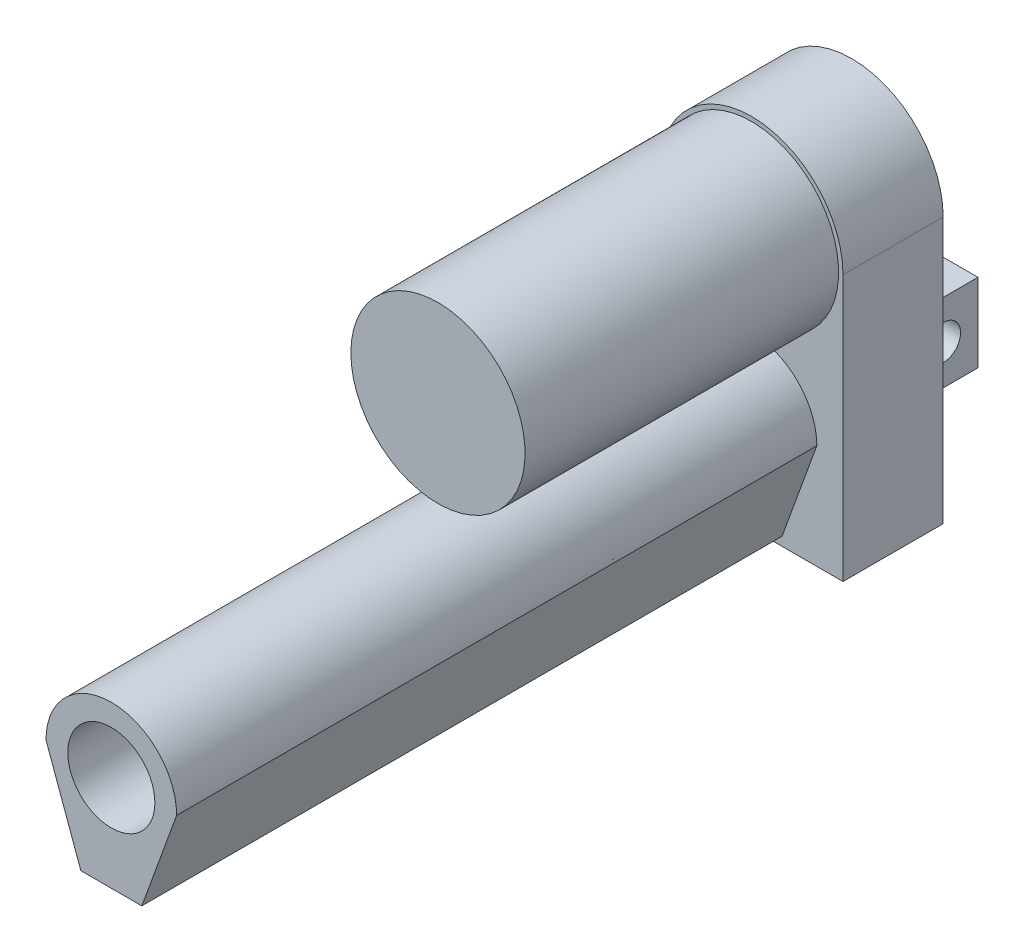
ISO-10303-21;
HEADER;
FILE_DESCRIPTION(('STEP AP214'),'2;1');
FILE_NAME('part.step','',(''),(''),'','','');
FILE_SCHEMA(('AUTOMOTIVE_DESIGN { 1 0 10303 214 1 1 1 1 }'));
ENDSEC;
DATA;
#1=APPLICATION_CONTEXT('core data for automotive mechanical design processes');
#2=APPLICATION_PROTOCOL_DEFINITION('international standard','automotive_design',2000,#1);
#3=PRODUCT_CONTEXT('',#1,'mechanical');
#4=PRODUCT('Part','Part','',(#3));
#5=PRODUCT_RELATED_PRODUCT_CATEGORY('part','',(#4));
#6=PRODUCT_DEFINITION_FORMATION('','',#4);
#7=PRODUCT_DEFINITION_CONTEXT('part definition',#1,'design');
#8=PRODUCT_DEFINITION('design','',#6,#7);
#9=PRODUCT_DEFINITION_SHAPE('','',#8);
#10=(LENGTH_UNIT() NAMED_UNIT(*) SI_UNIT(.MILLI.,.METRE.));
#11=(NAMED_UNIT(*) PLANE_ANGLE_UNIT() SI_UNIT($,.RADIAN.));
#12=(NAMED_UNIT(*) SI_UNIT($,.STERADIAN.) SOLID_ANGLE_UNIT());
#13=UNCERTAINTY_MEASURE_WITH_UNIT(LENGTH_MEASURE(1.E-05),#10,'distance_accuracy_value','');
#14=(GEOMETRIC_REPRESENTATION_CONTEXT(3) GLOBAL_UNCERTAINTY_ASSIGNED_CONTEXT((#13)) GLOBAL_UNIT_ASSIGNED_CONTEXT((#10,
#11,#12)) REPRESENTATION_CONTEXT('',''));
#15=CARTESIAN_POINT('',(0.,0.,0.));
#16=DIRECTION('',(0.,0.,1.));
#17=DIRECTION('',(1.,0.,0.));
#18=AXIS2_PLACEMENT_3D('',#15,#16,#17);
#19=CARTESIAN_POINT('',(0.,-37.,220.));
#20=DIRECTION('',(0.,0.,-1.));
#21=DIRECTION('',(-1.,0.,0.));
#22=AXIS2_PLACEMENT_3D('',#19,#20,#21);
#23=CYLINDRICAL_SURFACE('',#22,15.);
#24=DIRECTION('',(0.,0.,1.));
#25=VECTOR('',#24,1.);
#26=CARTESIAN_POINT('',(-15.,-37.,220.));
#27=LINE('',#26,#25);
#28=CARTESIAN_POINT('',(-15.,-37.,23.));
#29=VERTEX_POINT('',#28);
#30=CARTESIAN_POINT('',(-15.,-37.,170.));
#31=VERTEX_POINT('',#30);
#32=EDGE_CURVE('E164',#29,#31,#27,.T.);
#33=ORIENTED_EDGE('',*,*,#32,.T.);
#34=CARTESIAN_POINT('',(0.,-37.,170.));
#35=DIRECTION('',(0.,0.,1.));
#36=DIRECTION('',(1.,0.,0.));
#37=AXIS2_PLACEMENT_3D('',#34,#35,#36);
#38=CIRCLE('',#37,15.);
#39=CARTESIAN_POINT('',(15.,-37.,170.));
#40=VERTEX_POINT('',#39);
#41=EDGE_CURVE('E134',#40,#31,#38,.T.);
#42=ORIENTED_EDGE('',*,*,#41,.F.);
#43=DIRECTION('',(0.,0.,1.));
#44=VECTOR('',#43,1.);
#45=CARTESIAN_POINT('',(15.,-37.,220.));
#46=LINE('',#45,#44);
#47=CARTESIAN_POINT('',(15.,-37.,23.));
#48=VERTEX_POINT('',#47);
#49=EDGE_CURVE('E58',#40,#48,#46,.F.);
#50=ORIENTED_EDGE('',*,*,#49,.T.);
#51=CARTESIAN_POINT('',(0.,-37.,23.));
#52=DIRECTION('',(0.,0.,-1.));
#53=DIRECTION('',(-1.,0.,0.));
#54=AXIS2_PLACEMENT_3D('',#51,#52,#53);
#55=CIRCLE('',#54,15.);
#56=EDGE_CURVE('E173',#48,#29,#55,.F.);
#57=ORIENTED_EDGE('',*,*,#56,.T.);
#58=EDGE_LOOP('',(#33,#42,#50,#57));
#59=FACE_BOUND('',#58,.T.);
#60=ADVANCED_FACE('F32',(#59),#23,.T.);
#61=CARTESIAN_POINT('',(-15.,-37.,220.));
#62=DIRECTION('',(0.939793423488437,0.341743063086704,0.));
#63=DIRECTION('',(-0.341743063086704,0.939793423488437,0.));
#64=AXIS2_PLACEMENT_3D('',#61,#62,#63);
#65=PLANE('',#64);
#66=DIRECTION('',(0.341743063086704,-0.939793423488437,0.));
#67=VECTOR('',#66,1.);
#68=CARTESIAN_POINT('',(-15.,-37.,170.));
#69=LINE('',#68,#67);
#70=CARTESIAN_POINT('',(-7.,-59.,170.));
#71=VERTEX_POINT('',#70);
#72=EDGE_CURVE('E139',#31,#71,#69,.T.);
#73=ORIENTED_EDGE('',*,*,#72,.F.);
#74=ORIENTED_EDGE('',*,*,#32,.F.);
#75=DIRECTION('',(-0.341743063086704,0.939793423488437,0.));
#76=VECTOR('',#75,1.);
#77=CARTESIAN_POINT('',(-15.,-37.,23.));
#78=LINE('',#77,#76);
#79=CARTESIAN_POINT('',(-7.,-59.,23.));
#80=VERTEX_POINT('',#79);
#81=EDGE_CURVE('E160',#80,#29,#78,.T.);
#82=ORIENTED_EDGE('',*,*,#81,.F.);
#83=DIRECTION('',(0.,0.,1.));
#84=VECTOR('',#83,1.);
#85=CARTESIAN_POINT('',(-7.,-59.,220.));
#86=LINE('',#85,#84);
#87=EDGE_CURVE('E151',#80,#71,#86,.T.);
#88=ORIENTED_EDGE('',*,*,#87,.T.);
#89=EDGE_LOOP('',(#73,#74,#82,#88));
#90=FACE_BOUND('',#89,.T.);
#91=ADVANCED_FACE('F158',(#90),#65,.F.);
#92=CARTESIAN_POINT('',(-7.,-59.,220.));
#93=DIRECTION('',(0.,1.,0.));
#94=DIRECTION('',(0.,0.,1.));
#95=AXIS2_PLACEMENT_3D('',#92,#93,#94);
#96=PLANE('',#95);
#97=DIRECTION('',(1.,0.,0.));
#98=VECTOR('',#97,1.);
#99=CARTESIAN_POINT('',(-7.,-59.,170.));
#100=LINE('',#99,#98);
#101=CARTESIAN_POINT('',(7.,-59.,170.));
#102=VERTEX_POINT('',#101);
#103=EDGE_CURVE('E49',#71,#102,#100,.T.);
#104=ORIENTED_EDGE('',*,*,#103,.F.);
#105=ORIENTED_EDGE('',*,*,#87,.F.);
#106=DIRECTION('',(1.,0.,0.));
#107=VECTOR('',#106,1.);
#108=CARTESIAN_POINT('',(-7.,-59.,23.));
#109=LINE('',#108,#107);
#110=CARTESIAN_POINT('',(7.,-59.,23.));
#111=VERTEX_POINT('',#110);
#112=EDGE_CURVE('E161',#111,#80,#109,.F.);
#113=ORIENTED_EDGE('',*,*,#112,.F.);
#114=DIRECTION('',(0.,0.,1.));
#115=VECTOR('',#114,1.);
#116=CARTESIAN_POINT('',(7.,-59.,220.));
#117=LINE('',#116,#115);
#118=EDGE_CURVE('E154',#111,#102,#117,.T.);
#119=ORIENTED_EDGE('',*,*,#118,.T.);
#120=EDGE_LOOP('',(#104,#105,#113,#119));
#121=FACE_BOUND('',#120,.T.);
#122=ADVANCED_FACE('F150',(#121),#96,.F.);
#123=CARTESIAN_POINT('',(7.,-59.,220.));
#124=DIRECTION('',(-0.939793423488437,0.341743063086704,0.));
#125=DIRECTION('',(-0.341743063086704,-0.939793423488437,0.));
#126=AXIS2_PLACEMENT_3D('',#123,#124,#125);
#127=PLANE('',#126);
#128=DIRECTION('',(0.341743063086704,0.939793423488437,0.));
#129=VECTOR('',#128,1.);
#130=CARTESIAN_POINT('',(7.,-59.,170.));
#131=LINE('',#130,#129);
#132=EDGE_CURVE('E155',#102,#40,#131,.T.);
#133=ORIENTED_EDGE('',*,*,#132,.F.);
#134=ORIENTED_EDGE('',*,*,#118,.F.);
#135=DIRECTION('',(-0.341743063086704,-0.939793423488437,0.));
#136=VECTOR('',#135,1.);
#137=CARTESIAN_POINT('',(7.,-59.,23.));
#138=LINE('',#137,#136);
#139=EDGE_CURVE('E41',#48,#111,#138,.T.);
#140=ORIENTED_EDGE('',*,*,#139,.F.);
#141=ORIENTED_EDGE('',*,*,#49,.F.);
#142=EDGE_LOOP('',(#133,#134,#140,#141));
#143=FACE_BOUND('',#142,.T.);
#144=ADVANCED_FACE('F285',(#143),#127,.F.);
#145=CARTESIAN_POINT('',(0.,0.,-20.));
#146=DIRECTION('',(0.,0.,1.));
#147=DIRECTION('',(1.,0.,0.));
#148=AXIS2_PLACEMENT_3D('',#145,#146,#147);
#149=PLANE('',#148);
#150=DIRECTION('',(1.,0.,0.));
#151=VECTOR('',#150,1.);
#152=CARTESIAN_POINT('',(9.,-28.,-20.));
#153=LINE('',#152,#151);
#154=CARTESIAN_POINT('',(-9.,-28.,-20.));
#155=VERTEX_POINT('',#154);
#156=CARTESIAN_POINT('',(9.,-28.,-20.));
#157=VERTEX_POINT('',#156);
#158=EDGE_CURVE('E130',#155,#157,#153,.T.);
#159=ORIENTED_EDGE('',*,*,#158,.T.);
#160=DIRECTION('',(0.,1.,0.));
#161=VECTOR('',#160,1.);
#162=CARTESIAN_POINT('',(9.,-46.,-20.));
#163=LINE('',#162,#161);
#164=CARTESIAN_POINT('',(9.,-46.,-20.));
#165=VERTEX_POINT('',#164);
#166=EDGE_CURVE('E126',#157,#165,#163,.F.);
#167=ORIENTED_EDGE('',*,*,#166,.T.);
#168=DIRECTION('',(1.,0.,0.));
#169=VECTOR('',#168,1.);
#170=CARTESIAN_POINT('',(9.,-46.,-20.));
#171=LINE('',#170,#169);
#172=CARTESIAN_POINT('',(-9.,-46.,-20.));
#173=VERTEX_POINT('',#172);
#174=EDGE_CURVE('E245',#165,#173,#171,.F.);
#175=ORIENTED_EDGE('',*,*,#174,.T.);
#176=DIRECTION('',(0.,1.,0.));
#177=VECTOR('',#176,1.);
#178=CARTESIAN_POINT('',(-9.,-46.,-20.));
#179=LINE('',#178,#177);
#180=EDGE_CURVE('E242',#173,#155,#179,.T.);
#181=ORIENTED_EDGE('',*,*,#180,.T.);
#182=EDGE_LOOP('',(#159,#167,#175,#181));
#183=FACE_BOUND('',#182,.T.);
#184=ADVANCED_FACE('F34',(#183),#149,.F.);
#185=CARTESIAN_POINT('',(21.,-37.,-12.));
#186=DIRECTION('',(-1.,0.,0.));
#187=DIRECTION('',(0.,0.,1.));
#188=AXIS2_PLACEMENT_3D('',#185,#186,#187);
#189=CYLINDRICAL_SURFACE('',#188,4.);
#190=CARTESIAN_POINT('',(-9.,-37.,-12.));
#191=DIRECTION('',(-1.,0.,0.));
#192=DIRECTION('',(0.,0.,1.));
#193=AXIS2_PLACEMENT_3D('',#190,#191,#192);
#194=CIRCLE('',#193,4.);
#195=CARTESIAN_POINT('',(-9.,-37.,-8.));
#196=VERTEX_POINT('',#195);
#197=EDGE_CURVE('E225',#196,#196,#194,.T.);
#198=ORIENTED_EDGE('',*,*,#197,.T.);
#199=EDGE_LOOP('',(#198));
#200=FACE_BOUND('',#199,.T.);
#201=CARTESIAN_POINT('',(9.,-37.,-12.));
#202=DIRECTION('',(-1.,0.,0.));
#203=DIRECTION('',(0.,0.,1.));
#204=AXIS2_PLACEMENT_3D('',#201,#202,#203);
#205=CIRCLE('',#204,4.);
#206=CARTESIAN_POINT('',(9.,-37.,-8.));
#207=VERTEX_POINT('',#206);
#208=EDGE_CURVE('E250',#207,#207,#205,.F.);
#209=ORIENTED_EDGE('',*,*,#208,.T.);
#210=EDGE_LOOP('',(#209));
#211=FACE_BOUND('',#210,.T.);
#212=ADVANCED_FACE('F267',(#200,#211),#189,.F.);
#213=CARTESIAN_POINT('',(9.,-28.,-20.));
#214=DIRECTION('',(0.,-1.,0.));
#215=DIRECTION('',(1.,0.,0.));
#216=AXIS2_PLACEMENT_3D('',#213,#214,#215);
#217=PLANE('',#216);
#218=DIRECTION('',(0.,0.,1.));
#219=VECTOR('',#218,1.);
#220=CARTESIAN_POINT('',(9.,-28.,-20.));
#221=LINE('',#220,#219);
#222=CARTESIAN_POINT('',(9.,-28.,0.));
#223=VERTEX_POINT('',#222);
#224=EDGE_CURVE('E252',#223,#157,#221,.F.);
#225=ORIENTED_EDGE('',*,*,#224,.T.);
#226=ORIENTED_EDGE('',*,*,#158,.F.);
#227=DIRECTION('',(0.,0.,-1.));
#228=VECTOR('',#227,1.);
#229=CARTESIAN_POINT('',(-9.,-28.,-20.));
#230=LINE('',#229,#228);
#231=CARTESIAN_POINT('',(-9.,-28.,0.));
#232=VERTEX_POINT('',#231);
#233=EDGE_CURVE('E239',#155,#232,#230,.F.);
#234=ORIENTED_EDGE('',*,*,#233,.T.);
#235=DIRECTION('',(1.,0.,0.));
#236=VECTOR('',#235,1.);
#237=CARTESIAN_POINT('',(0.,-28.,0.));
#238=LINE('',#237,#236);
#239=EDGE_CURVE('E222',#232,#223,#238,.T.);
#240=ORIENTED_EDGE('',*,*,#239,.T.);
#241=EDGE_LOOP('',(#225,#226,#234,#240));
#242=FACE_BOUND('',#241,.T.);
#243=ADVANCED_FACE('F273',(#242),#217,.F.);
#244=CARTESIAN_POINT('',(9.,-46.,-20.));
#245=DIRECTION('',(-1.,0.,0.));
#246=DIRECTION('',(0.,0.,1.));
#247=AXIS2_PLACEMENT_3D('',#244,#245,#246);
#248=PLANE('',#247);
#249=ORIENTED_EDGE('',*,*,#208,.F.);
#250=EDGE_LOOP('',(#249));
#251=FACE_BOUND('',#250,.T.);
#252=DIRECTION('',(0.,0.,1.));
#253=VECTOR('',#252,1.);
#254=CARTESIAN_POINT('',(9.,-46.,-20.));
#255=LINE('',#254,#253);
#256=CARTESIAN_POINT('',(9.,-46.,0.));
#257=VERTEX_POINT('',#256);
#258=EDGE_CURVE('E247',#257,#165,#255,.F.);
#259=ORIENTED_EDGE('',*,*,#258,.T.);
#260=ORIENTED_EDGE('',*,*,#166,.F.);
#261=ORIENTED_EDGE('',*,*,#224,.F.);
#262=DIRECTION('',(0.,1.,0.));
#263=VECTOR('',#262,1.);
#264=CARTESIAN_POINT('',(9.,0.,0.));
#265=LINE('',#264,#263);
#266=EDGE_CURVE('E219',#223,#257,#265,.F.);
#267=ORIENTED_EDGE('',*,*,#266,.T.);
#268=EDGE_LOOP('',(#259,#260,#261,#267));
#269=FACE_BOUND('',#268,.T.);
#270=ADVANCED_FACE('F269',(#251,#269),#248,.F.);
#271=CARTESIAN_POINT('',(9.,-46.,-20.));
#272=DIRECTION('',(0.,1.,0.));
#273=DIRECTION('',(0.,0.,1.));
#274=AXIS2_PLACEMENT_3D('',#271,#272,#273);
#275=PLANE('',#274);
#276=DIRECTION('',(0.,0.,-1.));
#277=VECTOR('',#276,1.);
#278=CARTESIAN_POINT('',(-9.,-46.,-20.));
#279=LINE('',#278,#277);
#280=CARTESIAN_POINT('',(-9.,-46.,0.));
#281=VERTEX_POINT('',#280);
#282=EDGE_CURVE('E98',#281,#173,#279,.T.);
#283=ORIENTED_EDGE('',*,*,#282,.T.);
#284=ORIENTED_EDGE('',*,*,#174,.F.);
#285=ORIENTED_EDGE('',*,*,#258,.F.);
#286=DIRECTION('',(1.,0.,0.));
#287=VECTOR('',#286,1.);
#288=CARTESIAN_POINT('',(0.,-46.,0.));
#289=LINE('',#288,#287);
#290=EDGE_CURVE('E216',#257,#281,#289,.F.);
#291=ORIENTED_EDGE('',*,*,#290,.T.);
#292=EDGE_LOOP('',(#283,#284,#285,#291));
#293=FACE_BOUND('',#292,.T.);
#294=ADVANCED_FACE('F272',(#293),#275,.F.);
#295=CARTESIAN_POINT('',(-9.,-46.,-20.));
#296=DIRECTION('',(1.,0.,0.));
#297=DIRECTION('',(0.,0.,-1.));
#298=AXIS2_PLACEMENT_3D('',#295,#296,#297);
#299=PLANE('',#298);
#300=ORIENTED_EDGE('',*,*,#197,.F.);
#301=EDGE_LOOP('',(#300));
#302=FACE_BOUND('',#301,.T.);
#303=ORIENTED_EDGE('',*,*,#233,.F.);
#304=ORIENTED_EDGE('',*,*,#180,.F.);
#305=ORIENTED_EDGE('',*,*,#282,.F.);
#306=DIRECTION('',(0.,1.,0.));
#307=VECTOR('',#306,1.);
#308=CARTESIAN_POINT('',(-9.,0.,0.));
#309=LINE('',#308,#307);
#310=EDGE_CURVE('E214',#281,#232,#309,.T.);
#311=ORIENTED_EDGE('',*,*,#310,.T.);
#312=EDGE_LOOP('',(#303,#304,#305,#311));
#313=FACE_BOUND('',#312,.T.);
#314=ADVANCED_FACE('F282',(#302,#313),#299,.F.);
#315=CARTESIAN_POINT('',(0.,0.,0.));
#316=DIRECTION('',(0.,0.,1.));
#317=DIRECTION('',(1.,0.,0.));
#318=AXIS2_PLACEMENT_3D('',#315,#316,#317);
#319=PLANE('',#318);
#320=ORIENTED_EDGE('',*,*,#290,.F.);
#321=ORIENTED_EDGE('',*,*,#266,.F.);
#322=ORIENTED_EDGE('',*,*,#239,.F.);
#323=ORIENTED_EDGE('',*,*,#310,.F.);
#324=EDGE_LOOP('',(#320,#321,#322,#323));
#325=FACE_BOUND('',#324,.T.);
#326=DIRECTION('',(0.,-1.,0.));
#327=VECTOR('',#326,1.);
#328=CARTESIAN_POINT('',(21.,0.,0.));
#329=LINE('',#328,#327);
#330=CARTESIAN_POINT('',(21.,0.,0.));
#331=VERTEX_POINT('',#330);
#332=CARTESIAN_POINT('',(21.,-61.,0.));
#333=VERTEX_POINT('',#332);
#334=EDGE_CURVE('E196',#331,#333,#329,.T.);
#335=ORIENTED_EDGE('',*,*,#334,.T.);
#336=DIRECTION('',(1.,0.,0.));
#337=VECTOR('',#336,1.);
#338=CARTESIAN_POINT('',(-21.,-61.,0.));
#339=LINE('',#338,#337);
#340=CARTESIAN_POINT('',(-21.,-61.,0.));
#341=VERTEX_POINT('',#340);
#342=EDGE_CURVE('E200',#333,#341,#339,.F.);
#343=ORIENTED_EDGE('',*,*,#342,.T.);
#344=DIRECTION('',(0.,1.,0.));
#345=VECTOR('',#344,1.);
#346=CARTESIAN_POINT('',(-21.,0.,0.));
#347=LINE('',#346,#345);
#348=CARTESIAN_POINT('',(-21.,0.,0.));
#349=VERTEX_POINT('',#348);
#350=EDGE_CURVE('E209',#341,#349,#347,.T.);
#351=ORIENTED_EDGE('',*,*,#350,.T.);
#352=CARTESIAN_POINT('',(0.,0.,0.));
#353=DIRECTION('',(0.,0.,-1.));
#354=DIRECTION('',(-1.,0.,0.));
#355=AXIS2_PLACEMENT_3D('',#352,#353,#354);
#356=CIRCLE('',#355,21.);
#357=EDGE_CURVE('E87',#331,#349,#356,.F.);
#358=ORIENTED_EDGE('',*,*,#357,.F.);
#359=EDGE_LOOP('',(#335,#343,#351,#358));
#360=FACE_BOUND('',#359,.T.);
#361=ADVANCED_FACE('F279',(#325,#360),#319,.F.);
#362=CARTESIAN_POINT('',(0.,0.,95.));
#363=DIRECTION('',(0.,0.,1.));
#364=DIRECTION('',(1.,0.,0.));
#365=AXIS2_PLACEMENT_3D('',#362,#363,#364);
#366=PLANE('',#365);
#367=CARTESIAN_POINT('',(0.,0.,95.));
#368=DIRECTION('',(0.,0.,-1.));
#369=DIRECTION('',(-1.,0.,0.));
#370=AXIS2_PLACEMENT_3D('',#367,#368,#369);
#371=CIRCLE('',#370,20.);
#372=CARTESIAN_POINT('',(-20.,0.,95.));
#373=VERTEX_POINT('',#372);
#374=EDGE_CURVE('E228',#373,#373,#371,.T.);
#375=ORIENTED_EDGE('',*,*,#374,.F.);
#376=EDGE_LOOP('',(#375));
#377=FACE_BOUND('',#376,.T.);
#378=ADVANCED_FACE('F330',(#377),#366,.T.);
#379=CARTESIAN_POINT('',(0.,0.,23.));
#380=DIRECTION('',(0.,0.,-1.));
#381=DIRECTION('',(-1.,0.,0.));
#382=AXIS2_PLACEMENT_3D('',#379,#380,#381);
#383=CYLINDRICAL_SURFACE('',#382,21.);
#384=CARTESIAN_POINT('',(0.,0.,23.));
#385=DIRECTION('',(0.,0.,-1.));
#386=DIRECTION('',(-1.,0.,0.));
#387=AXIS2_PLACEMENT_3D('',#384,#385,#386);
#388=CIRCLE('',#387,21.);
#389=CARTESIAN_POINT('',(21.,0.,23.));
#390=VERTEX_POINT('',#389);
#391=CARTESIAN_POINT('',(-21.,0.,23.));
#392=VERTEX_POINT('',#391);
#393=EDGE_CURVE('E183',#390,#392,#388,.F.);
#394=ORIENTED_EDGE('',*,*,#393,.F.);
#395=DIRECTION('',(0.,0.,1.));
#396=VECTOR('',#395,1.);
#397=CARTESIAN_POINT('',(21.,0.,23.));
#398=LINE('',#397,#396);
#399=EDGE_CURVE('E194',#390,#331,#398,.F.);
#400=ORIENTED_EDGE('',*,*,#399,.T.);
#401=ORIENTED_EDGE('',*,*,#357,.T.);
#402=DIRECTION('',(0.,0.,1.));
#403=VECTOR('',#402,1.);
#404=CARTESIAN_POINT('',(-21.,0.,23.));
#405=LINE('',#404,#403);
#406=EDGE_CURVE('E212',#349,#392,#405,.T.);
#407=ORIENTED_EDGE('',*,*,#406,.T.);
#408=EDGE_LOOP('',(#394,#400,#401,#407));
#409=FACE_BOUND('',#408,.T.);
#410=ADVANCED_FACE('F326',(#409),#383,.T.);
#411=CARTESIAN_POINT('',(-21.,0.,23.));
#412=DIRECTION('',(1.,0.,0.));
#413=DIRECTION('',(0.,1.,0.));
#414=AXIS2_PLACEMENT_3D('',#411,#412,#413);
#415=PLANE('',#414);
#416=DIRECTION('',(0.,0.,1.));
#417=VECTOR('',#416,1.);
#418=CARTESIAN_POINT('',(-21.,-61.,23.));
#419=LINE('',#418,#417);
#420=CARTESIAN_POINT('',(-21.,-61.,23.));
#421=VERTEX_POINT('',#420);
#422=EDGE_CURVE('E206',#341,#421,#419,.T.);
#423=ORIENTED_EDGE('',*,*,#422,.T.);
#424=DIRECTION('',(0.,1.,0.));
#425=VECTOR('',#424,1.);
#426=CARTESIAN_POINT('',(-21.,0.,23.));
#427=LINE('',#426,#425);
#428=EDGE_CURVE('E181',#392,#421,#427,.F.);
#429=ORIENTED_EDGE('',*,*,#428,.F.);
#430=ORIENTED_EDGE('',*,*,#406,.F.);
#431=ORIENTED_EDGE('',*,*,#350,.F.);
#432=EDGE_LOOP('',(#423,#429,#430,#431));
#433=FACE_BOUND('',#432,.T.);
#434=ADVANCED_FACE('F322',(#433),#415,.F.);
#435=CARTESIAN_POINT('',(-21.,-61.,23.));
#436=DIRECTION('',(0.,1.,0.));
#437=DIRECTION('',(0.,0.,1.));
#438=AXIS2_PLACEMENT_3D('',#435,#436,#437);
#439=PLANE('',#438);
#440=DIRECTION('',(0.,0.,1.));
#441=VECTOR('',#440,1.);
#442=CARTESIAN_POINT('',(21.,-61.,23.));
#443=LINE('',#442,#441);
#444=CARTESIAN_POINT('',(21.,-61.,23.));
#445=VERTEX_POINT('',#444);
#446=EDGE_CURVE('E197',#333,#445,#443,.T.);
#447=ORIENTED_EDGE('',*,*,#446,.T.);
#448=DIRECTION('',(1.,0.,0.));
#449=VECTOR('',#448,1.);
#450=CARTESIAN_POINT('',(0.,-61.,23.));
#451=LINE('',#450,#449);
#452=EDGE_CURVE('E178',#421,#445,#451,.T.);
#453=ORIENTED_EDGE('',*,*,#452,.F.);
#454=ORIENTED_EDGE('',*,*,#422,.F.);
#455=ORIENTED_EDGE('',*,*,#342,.F.);
#456=EDGE_LOOP('',(#447,#453,#454,#455));
#457=FACE_BOUND('',#456,.T.);
#458=ADVANCED_FACE('F318',(#457),#439,.F.);
#459=CARTESIAN_POINT('',(21.,0.,23.));
#460=DIRECTION('',(-1.,0.,0.));
#461=DIRECTION('',(0.,-1.,0.));
#462=AXIS2_PLACEMENT_3D('',#459,#460,#461);
#463=PLANE('',#462);
#464=ORIENTED_EDGE('',*,*,#399,.F.);
#465=DIRECTION('',(0.,1.,0.));
#466=VECTOR('',#465,1.);
#467=CARTESIAN_POINT('',(21.,0.,23.));
#468=LINE('',#467,#466);
#469=EDGE_CURVE('E174',#445,#390,#468,.T.);
#470=ORIENTED_EDGE('',*,*,#469,.F.);
#471=ORIENTED_EDGE('',*,*,#446,.F.);
#472=ORIENTED_EDGE('',*,*,#334,.F.);
#473=EDGE_LOOP('',(#464,#470,#471,#472));
#474=FACE_BOUND('',#473,.T.);
#475=ADVANCED_FACE('F314',(#474),#463,.F.);
#476=CARTESIAN_POINT('',(0.,0.,95.));
#477=DIRECTION('',(0.,0.,-1.));
#478=DIRECTION('',(-1.,0.,0.));
#479=AXIS2_PLACEMENT_3D('',#476,#477,#478);
#480=CYLINDRICAL_SURFACE('',#479,20.);
#481=ORIENTED_EDGE('',*,*,#374,.T.);
#482=EDGE_LOOP('',(#481));
#483=FACE_BOUND('',#482,.T.);
#484=CARTESIAN_POINT('',(0.,0.,23.));
#485=DIRECTION('',(0.,0.,-1.));
#486=DIRECTION('',(-1.,0.,0.));
#487=AXIS2_PLACEMENT_3D('',#484,#485,#486);
#488=CIRCLE('',#487,20.);
#489=CARTESIAN_POINT('',(-20.,0.,23.));
#490=VERTEX_POINT('',#489);
#491=EDGE_CURVE('E177',#490,#490,#488,.T.);
#492=ORIENTED_EDGE('',*,*,#491,.F.);
#493=EDGE_LOOP('',(#492));
#494=FACE_BOUND('',#493,.T.);
#495=ADVANCED_FACE('F310',(#483,#494),#480,.T.);
#496=CARTESIAN_POINT('',(0.,0.,23.));
#497=DIRECTION('',(0.,0.,1.));
#498=DIRECTION('',(1.,0.,0.));
#499=AXIS2_PLACEMENT_3D('',#496,#497,#498);
#500=PLANE('',#499);
#501=ORIENTED_EDGE('',*,*,#491,.T.);
#502=EDGE_LOOP('',(#501));
#503=FACE_BOUND('',#502,.T.);
#504=ORIENTED_EDGE('',*,*,#139,.T.);
#505=ORIENTED_EDGE('',*,*,#112,.T.);
#506=ORIENTED_EDGE('',*,*,#81,.T.);
#507=ORIENTED_EDGE('',*,*,#56,.F.);
#508=EDGE_LOOP('',(#504,#505,#506,#507));
#509=FACE_BOUND('',#508,.T.);
#510=ORIENTED_EDGE('',*,*,#452,.T.);
#511=ORIENTED_EDGE('',*,*,#469,.T.);
#512=ORIENTED_EDGE('',*,*,#393,.T.);
#513=ORIENTED_EDGE('',*,*,#428,.T.);
#514=EDGE_LOOP('',(#510,#511,#512,#513));
#515=FACE_BOUND('',#514,.T.);
#516=ADVANCED_FACE('F296',(#503,#509,#515),#500,.T.);
#517=CARTESIAN_POINT('',(0.,-37.,170.));
#518=DIRECTION('',(0.,0.,1.));
#519=DIRECTION('',(1.,0.,0.));
#520=AXIS2_PLACEMENT_3D('',#517,#518,#519);
#521=PLANE('',#520);
#522=ORIENTED_EDGE('',*,*,#72,.T.);
#523=ORIENTED_EDGE('',*,*,#103,.T.);
#524=ORIENTED_EDGE('',*,*,#132,.T.);
#525=ORIENTED_EDGE('',*,*,#41,.T.);
#526=EDGE_LOOP('',(#522,#523,#524,#525));
#527=FACE_BOUND('',#526,.T.);
#528=CARTESIAN_POINT('',(0.,-37.,170.));
#529=DIRECTION('',(0.,0.,1.));
#530=DIRECTION('',(1.,0.,0.));
#531=AXIS2_PLACEMENT_3D('',#528,#529,#530);
#532=CIRCLE('',#531,10.);
#533=CARTESIAN_POINT('',(10.,-37.,170.));
#534=VERTEX_POINT('',#533);
#535=EDGE_CURVE('E36',#534,#534,#532,.F.);
#536=ORIENTED_EDGE('',*,*,#535,.T.);
#537=EDGE_LOOP('',(#536));
#538=FACE_BOUND('',#537,.T.);
#539=ADVANCED_FACE('F140',(#527,#538),#521,.T.);
#540=CARTESIAN_POINT('',(0.,0.,23.));
#541=DIRECTION('',(0.,0.,1.));
#542=DIRECTION('',(1.,0.,0.));
#543=AXIS2_PLACEMENT_3D('',#540,#541,#542);
#544=PLANE('',#543);
#545=CARTESIAN_POINT('',(0.,-37.,23.));
#546=DIRECTION('',(0.,0.,-1.));
#547=DIRECTION('',(-1.,0.,0.));
#548=AXIS2_PLACEMENT_3D('',#545,#546,#547);
#549=CIRCLE('',#548,10.);
#550=CARTESIAN_POINT('',(-10.,-37.,23.));
#551=VERTEX_POINT('',#550);
#552=EDGE_CURVE('E11',#551,#551,#549,.F.);
#553=ORIENTED_EDGE('',*,*,#552,.T.);
#554=EDGE_LOOP('',(#553));
#555=FACE_BOUND('',#554,.T.);
#556=ADVANCED_FACE('F298',(#555),#544,.T.);
#557=CARTESIAN_POINT('',(0.,-37.,220.));
#558=DIRECTION('',(0.,0.,-1.));
#559=DIRECTION('',(-1.,0.,0.));
#560=AXIS2_PLACEMENT_3D('',#557,#558,#559);
#561=CYLINDRICAL_SURFACE('',#560,10.);
#562=ORIENTED_EDGE('',*,*,#552,.F.);
#563=EDGE_LOOP('',(#562));
#564=FACE_BOUND('',#563,.T.);
#565=ORIENTED_EDGE('',*,*,#535,.F.);
#566=EDGE_LOOP('',(#565));
#567=FACE_BOUND('',#566,.T.);
#568=ADVANCED_FACE('F363',(#564,#567),#561,.F.);
#569=CLOSED_SHELL('',(#60,#91,#122,#144,#184,#212,#243,#270,#294,#314,#361,#378,#410,#434,#458,
#475,#495,#516,#539,#556,#568));
#570=MANIFOLD_SOLID_BREP('B2',#569);
#571=ADVANCED_BREP_SHAPE_REPRESENTATION('',(#18,#570),#14);
#572=SHAPE_DEFINITION_REPRESENTATION(#9,#571);
ENDSEC;
END-ISO-10303-21;
